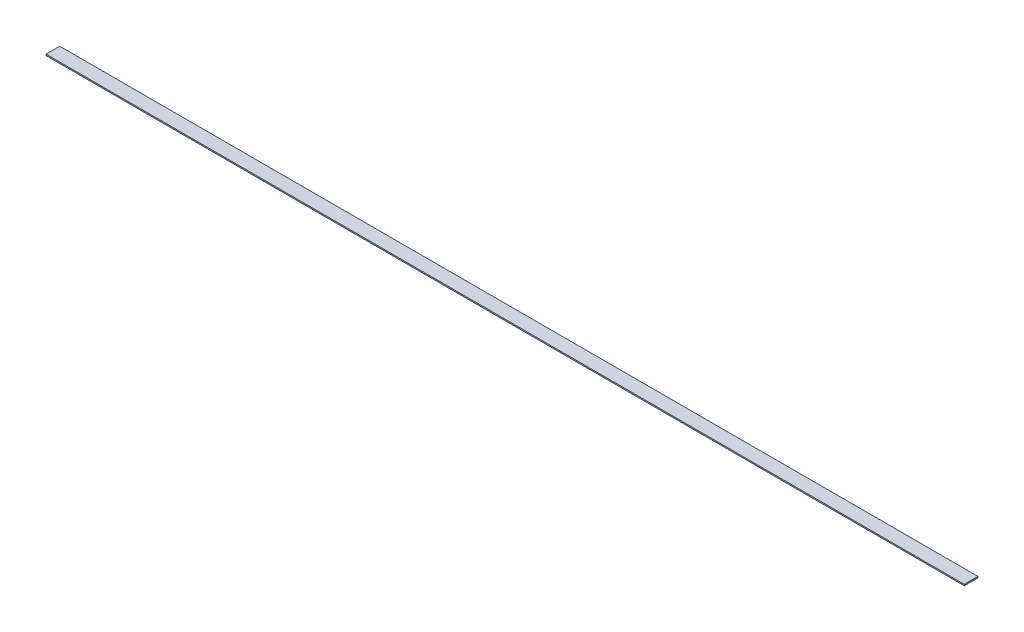
ISO-10303-21;
HEADER;
FILE_DESCRIPTION(('STEP AP214'),'2;1');
FILE_NAME('part.step','',(''),(''),'','','');
FILE_SCHEMA(('AUTOMOTIVE_DESIGN { 1 0 10303 214 1 1 1 1 }'));
ENDSEC;
DATA;
#1=APPLICATION_CONTEXT('core data for automotive mechanical design processes');
#2=APPLICATION_PROTOCOL_DEFINITION('international standard','automotive_design',2000,#1);
#3=PRODUCT_CONTEXT('',#1,'mechanical');
#4=PRODUCT('Part','Part','',(#3));
#5=PRODUCT_RELATED_PRODUCT_CATEGORY('part','',(#4));
#6=PRODUCT_DEFINITION_FORMATION('','',#4);
#7=PRODUCT_DEFINITION_CONTEXT('part definition',#1,'design');
#8=PRODUCT_DEFINITION('design','',#6,#7);
#9=PRODUCT_DEFINITION_SHAPE('','',#8);
#10=(LENGTH_UNIT() NAMED_UNIT(*) SI_UNIT(.MILLI.,.METRE.));
#11=(NAMED_UNIT(*) PLANE_ANGLE_UNIT() SI_UNIT($,.RADIAN.));
#12=(NAMED_UNIT(*) SI_UNIT($,.STERADIAN.) SOLID_ANGLE_UNIT());
#13=UNCERTAINTY_MEASURE_WITH_UNIT(LENGTH_MEASURE(1.E-05),#10,'distance_accuracy_value','');
#14=(GEOMETRIC_REPRESENTATION_CONTEXT(3) GLOBAL_UNCERTAINTY_ASSIGNED_CONTEXT((#13)) GLOBAL_UNIT_ASSIGNED_CONTEXT((#10,
#11,#12)) REPRESENTATION_CONTEXT('',''));
#15=CARTESIAN_POINT('',(0.,0.,0.));
#16=DIRECTION('',(0.,0.,1.));
#17=DIRECTION('',(1.,0.,0.));
#18=AXIS2_PLACEMENT_3D('',#15,#16,#17);
#19=CARTESIAN_POINT('',(1701.8,4.7625,-25.4));
#20=DIRECTION('',(-1.,0.,0.));
#21=DIRECTION('',(0.,0.,1.));
#22=AXIS2_PLACEMENT_3D('',#19,#20,#21);
#23=PLANE('',#22);
#24=DIRECTION('',(0.,0.,-1.));
#25=VECTOR('',#24,1.);
#26=CARTESIAN_POINT('',(1701.8,0.,-25.4));
#27=LINE('',#26,#25);
#28=CARTESIAN_POINT('',(1701.8,0.,25.4));
#29=VERTEX_POINT('',#28);
#30=CARTESIAN_POINT('',(1701.8,0.,-25.4));
#31=VERTEX_POINT('',#30);
#32=EDGE_CURVE('E96',#29,#31,#27,.T.);
#33=ORIENTED_EDGE('',*,*,#32,.T.);
#34=DIRECTION('',(0.,-1.,0.));
#35=VECTOR('',#34,1.);
#36=CARTESIAN_POINT('',(1701.8,4.7625,-25.4));
#37=LINE('',#36,#35);
#38=CARTESIAN_POINT('',(1701.8,4.7625,-25.4));
#39=VERTEX_POINT('',#38);
#40=EDGE_CURVE('E11',#39,#31,#37,.T.);
#41=ORIENTED_EDGE('',*,*,#40,.F.);
#42=DIRECTION('',(0.,0.,-1.));
#43=VECTOR('',#42,1.);
#44=CARTESIAN_POINT('',(1701.8,4.7625,-25.4));
#45=LINE('',#44,#43);
#46=CARTESIAN_POINT('',(1701.8,4.7625,25.4));
#47=VERTEX_POINT('',#46);
#48=EDGE_CURVE('E84',#47,#39,#45,.T.);
#49=ORIENTED_EDGE('',*,*,#48,.F.);
#50=DIRECTION('',(0.,-1.,0.));
#51=VECTOR('',#50,1.);
#52=CARTESIAN_POINT('',(1701.8,4.7625,25.4));
#53=LINE('',#52,#51);
#54=EDGE_CURVE('E92',#47,#29,#53,.T.);
#55=ORIENTED_EDGE('',*,*,#54,.T.);
#56=EDGE_LOOP('',(#33,#41,#49,#55));
#57=FACE_BOUND('',#56,.T.);
#58=ADVANCED_FACE('F33',(#57),#23,.F.);
#59=CARTESIAN_POINT('',(-1701.8,4.7625,-25.4));
#60=DIRECTION('',(0.,0.,1.));
#61=DIRECTION('',(1.,0.,0.));
#62=AXIS2_PLACEMENT_3D('',#59,#60,#61);
#63=PLANE('',#62);
#64=DIRECTION('',(-1.,0.,0.));
#65=VECTOR('',#64,1.);
#66=CARTESIAN_POINT('',(-1701.8,0.,-25.4));
#67=LINE('',#66,#65);
#68=CARTESIAN_POINT('',(-1701.8,0.,-25.4));
#69=VERTEX_POINT('',#68);
#70=EDGE_CURVE('E88',#31,#69,#67,.T.);
#71=ORIENTED_EDGE('',*,*,#70,.T.);
#72=DIRECTION('',(0.,-1.,0.));
#73=VECTOR('',#72,1.);
#74=CARTESIAN_POINT('',(-1701.8,4.7625,-25.4));
#75=LINE('',#74,#73);
#76=CARTESIAN_POINT('',(-1701.8,4.7625,-25.4));
#77=VERTEX_POINT('',#76);
#78=EDGE_CURVE('E41',#77,#69,#75,.T.);
#79=ORIENTED_EDGE('',*,*,#78,.F.);
#80=DIRECTION('',(-1.,0.,0.));
#81=VECTOR('',#80,1.);
#82=CARTESIAN_POINT('',(-1701.8,4.7625,-25.4));
#83=LINE('',#82,#81);
#84=EDGE_CURVE('E79',#39,#77,#83,.T.);
#85=ORIENTED_EDGE('',*,*,#84,.F.);
#86=ORIENTED_EDGE('',*,*,#40,.T.);
#87=EDGE_LOOP('',(#71,#79,#85,#86));
#88=FACE_BOUND('',#87,.T.);
#89=ADVANCED_FACE('F87',(#88),#63,.F.);
#90=CARTESIAN_POINT('',(-1701.8,4.7625,-25.4));
#91=DIRECTION('',(1.,0.,0.));
#92=DIRECTION('',(0.,0.,-1.));
#93=AXIS2_PLACEMENT_3D('',#90,#91,#92);
#94=PLANE('',#93);
#95=DIRECTION('',(0.,0.,1.));
#96=VECTOR('',#95,1.);
#97=CARTESIAN_POINT('',(-1701.8,0.,-25.4));
#98=LINE('',#97,#96);
#99=CARTESIAN_POINT('',(-1701.8,0.,25.4));
#100=VERTEX_POINT('',#99);
#101=EDGE_CURVE('E66',#69,#100,#98,.T.);
#102=ORIENTED_EDGE('',*,*,#101,.T.);
#103=DIRECTION('',(0.,-1.,0.));
#104=VECTOR('',#103,1.);
#105=CARTESIAN_POINT('',(-1701.8,4.7625,25.4));
#106=LINE('',#105,#104);
#107=CARTESIAN_POINT('',(-1701.8,4.7625,25.4));
#108=VERTEX_POINT('',#107);
#109=EDGE_CURVE('E89',#108,#100,#106,.T.);
#110=ORIENTED_EDGE('',*,*,#109,.F.);
#111=DIRECTION('',(0.,0.,1.));
#112=VECTOR('',#111,1.);
#113=CARTESIAN_POINT('',(-1701.8,4.7625,-25.4));
#114=LINE('',#113,#112);
#115=EDGE_CURVE('E82',#77,#108,#114,.T.);
#116=ORIENTED_EDGE('',*,*,#115,.F.);
#117=ORIENTED_EDGE('',*,*,#78,.T.);
#118=EDGE_LOOP('',(#102,#110,#116,#117));
#119=FACE_BOUND('',#118,.T.);
#120=ADVANCED_FACE('F90',(#119),#94,.F.);
#121=CARTESIAN_POINT('',(-1701.8,4.7625,25.4));
#122=DIRECTION('',(0.,0.,-1.));
#123=DIRECTION('',(-1.,0.,0.));
#124=AXIS2_PLACEMENT_3D('',#121,#122,#123);
#125=PLANE('',#124);
#126=DIRECTION('',(1.,0.,0.));
#127=VECTOR('',#126,1.);
#128=CARTESIAN_POINT('',(-1701.8,0.,25.4));
#129=LINE('',#128,#127);
#130=EDGE_CURVE('E72',#100,#29,#129,.T.);
#131=ORIENTED_EDGE('',*,*,#130,.T.);
#132=ORIENTED_EDGE('',*,*,#54,.F.);
#133=DIRECTION('',(1.,0.,0.));
#134=VECTOR('',#133,1.);
#135=CARTESIAN_POINT('',(-1701.8,4.7625,25.4));
#136=LINE('',#135,#134);
#137=EDGE_CURVE('E49',#108,#47,#136,.T.);
#138=ORIENTED_EDGE('',*,*,#137,.F.);
#139=ORIENTED_EDGE('',*,*,#109,.T.);
#140=EDGE_LOOP('',(#131,#132,#138,#139));
#141=FACE_BOUND('',#140,.T.);
#142=ADVANCED_FACE('F103',(#141),#125,.F.);
#143=CARTESIAN_POINT('',(1701.8,4.7625,25.4));
#144=DIRECTION('',(0.,1.,0.));
#145=DIRECTION('',(0.,0.,1.));
#146=AXIS2_PLACEMENT_3D('',#143,#144,#145);
#147=PLANE('',#146);
#148=ORIENTED_EDGE('',*,*,#48,.T.);
#149=ORIENTED_EDGE('',*,*,#84,.T.);
#150=ORIENTED_EDGE('',*,*,#115,.T.);
#151=ORIENTED_EDGE('',*,*,#137,.T.);
#152=EDGE_LOOP('',(#148,#149,#150,#151));
#153=FACE_BOUND('',#152,.T.);
#154=ADVANCED_FACE('F80',(#153),#147,.T.);
#155=CARTESIAN_POINT('',(1701.8,0.,25.4));
#156=DIRECTION('',(0.,1.,0.));
#157=DIRECTION('',(0.,0.,1.));
#158=AXIS2_PLACEMENT_3D('',#155,#156,#157);
#159=PLANE('',#158);
#160=ORIENTED_EDGE('',*,*,#32,.F.);
#161=ORIENTED_EDGE('',*,*,#130,.F.);
#162=ORIENTED_EDGE('',*,*,#101,.F.);
#163=ORIENTED_EDGE('',*,*,#70,.F.);
#164=EDGE_LOOP('',(#160,#161,#162,#163));
#165=FACE_BOUND('',#164,.T.);
#166=ADVANCED_FACE('F106',(#165),#159,.F.);
#167=CLOSED_SHELL('',(#58,#89,#120,#142,#154,#166));
#168=MANIFOLD_SOLID_BREP('B2',#167);
#169=ADVANCED_BREP_SHAPE_REPRESENTATION('',(#18,#168),#14);
#170=SHAPE_DEFINITION_REPRESENTATION(#9,#169);
ENDSEC;
END-ISO-10303-21;
